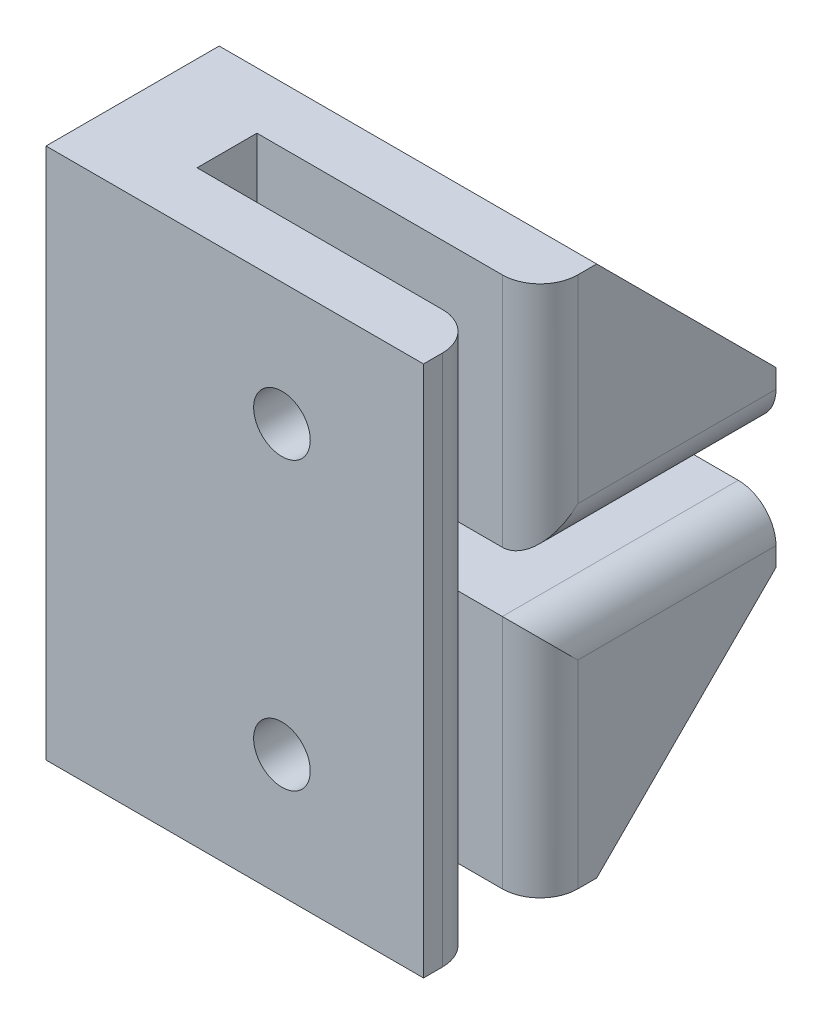
ISO-10303-21;
HEADER;
FILE_DESCRIPTION(('STEP AP214'),'2;1');
FILE_NAME('part.step','',(''),(''),'','','');
FILE_SCHEMA(('AUTOMOTIVE_DESIGN { 1 0 10303 214 1 1 1 1 }'));
ENDSEC;
DATA;
#1=APPLICATION_CONTEXT('core data for automotive mechanical design processes');
#2=APPLICATION_PROTOCOL_DEFINITION('international standard','automotive_design',2000,#1);
#3=PRODUCT_CONTEXT('',#1,'mechanical');
#4=PRODUCT('Part','Part','',(#3));
#5=PRODUCT_RELATED_PRODUCT_CATEGORY('part','',(#4));
#6=PRODUCT_DEFINITION_FORMATION('','',#4);
#7=PRODUCT_DEFINITION_CONTEXT('part definition',#1,'design');
#8=PRODUCT_DEFINITION('design','',#6,#7);
#9=PRODUCT_DEFINITION_SHAPE('','',#8);
#10=(LENGTH_UNIT() NAMED_UNIT(*) SI_UNIT(.MILLI.,.METRE.));
#11=(NAMED_UNIT(*) PLANE_ANGLE_UNIT() SI_UNIT($,.RADIAN.));
#12=(NAMED_UNIT(*) SI_UNIT($,.STERADIAN.) SOLID_ANGLE_UNIT());
#13=UNCERTAINTY_MEASURE_WITH_UNIT(LENGTH_MEASURE(1.E-05),#10,'distance_accuracy_value','');
#14=(GEOMETRIC_REPRESENTATION_CONTEXT(3) GLOBAL_UNCERTAINTY_ASSIGNED_CONTEXT((#13)) GLOBAL_UNIT_ASSIGNED_CONTEXT((#10,
#11,#12)) REPRESENTATION_CONTEXT('',''));
#15=CARTESIAN_POINT('',(0.,0.,0.));
#16=DIRECTION('',(0.,0.,1.));
#17=DIRECTION('',(1.,0.,0.));
#18=AXIS2_PLACEMENT_3D('',#15,#16,#17);
#19=CARTESIAN_POINT('',(20.2180793651192,-0.0317499401236413,0.0438719111567397));
#20=DIRECTION('',(1.,0.,0.));
#21=DIRECTION('',(0.,0.,-1.));
#22=AXIS2_PLACEMENT_3D('',#19,#20,#21);
#23=PLANE('',#22);
#24=DIRECTION('',(0.,0.,-1.));
#25=VECTOR('',#24,1.);
#26=CARTESIAN_POINT('',(20.2180793651192,-12.7817499401236,0.0438719111567382));
#27=LINE('',#26,#25);
#28=CARTESIAN_POINT('',(20.2180793651192,-12.7817499401236,6.34237191115674));
#29=VERTEX_POINT('',#28);
#30=CARTESIAN_POINT('',(20.2180793651192,-12.7817499401236,5.32237191115674));
#31=VERTEX_POINT('',#30);
#32=EDGE_CURVE('E243',#29,#31,#27,.T.);
#33=ORIENTED_EDGE('',*,*,#32,.T.);
#34=DIRECTION('',(0.,-1.,0.));
#35=VECTOR('',#34,1.);
#36=CARTESIAN_POINT('',(20.2180793651192,15.9567500598764,5.32237191115674));
#37=LINE('',#36,#35);
#38=CARTESIAN_POINT('',(20.2180793651192,15.9567500598764,5.32237191115674));
#39=VERTEX_POINT('',#38);
#40=EDGE_CURVE('E336',#31,#39,#37,.F.);
#41=ORIENTED_EDGE('',*,*,#40,.T.);
#42=DIRECTION('',(0.,0.,1.));
#43=VECTOR('',#42,1.);
#44=CARTESIAN_POINT('',(20.2180793651192,15.9567500598764,0.0438719111567396));
#45=LINE('',#44,#43);
#46=CARTESIAN_POINT('',(20.2180793651192,15.9567500598764,6.34237191115674));
#47=VERTEX_POINT('',#46);
#48=EDGE_CURVE('E259',#39,#47,#45,.T.);
#49=ORIENTED_EDGE('',*,*,#48,.T.);
#50=DIRECTION('',(0.,-1.,0.));
#51=VECTOR('',#50,1.);
#52=CARTESIAN_POINT('',(20.2180793651192,15.9567500598764,6.34237191115674));
#53=LINE('',#52,#51);
#54=EDGE_CURVE('E264',#47,#29,#53,.T.);
#55=ORIENTED_EDGE('',*,*,#54,.T.);
#56=EDGE_LOOP('',(#33,#41,#49,#55));
#57=FACE_BOUND('',#56,.T.);
#58=ADVANCED_FACE('F38',(#57),#23,.T.);
#59=CARTESIAN_POINT('',(20.2180793651192,15.9567500598764,-3.01612808884326));
#60=VERTEX_POINT('',#59);
#61=CARTESIAN_POINT('',(20.2180793651192,15.9567500598764,-1.99612808884326));
#62=VERTEX_POINT('',#61);
#63=EDGE_CURVE('E260',#60,#62,#45,.T.);
#64=ORIENTED_EDGE('',*,*,#63,.T.);
#65=DIRECTION('',(0.,1.,0.));
#66=VECTOR('',#65,1.);
#67=CARTESIAN_POINT('',(20.2180793651192,3.20675005987636,-1.99612808884326));
#68=LINE('',#67,#66);
#69=CARTESIAN_POINT('',(20.2180793651192,5.24675005987636,-1.99612808884326));
#70=VERTEX_POINT('',#69);
#71=EDGE_CURVE('E325',#62,#70,#68,.F.);
#72=ORIENTED_EDGE('',*,*,#71,.T.);
#73=DIRECTION('',(0.,0.,1.));
#74=VECTOR('',#73,1.);
#75=CARTESIAN_POINT('',(20.2180793651192,5.24675005987636,-12.7061280888433));
#76=LINE('',#75,#74);
#77=CARTESIAN_POINT('',(20.2180793651192,5.24675005987636,-12.7061280888433));
#78=VERTEX_POINT('',#77);
#79=EDGE_CURVE('E322',#70,#78,#76,.F.);
#80=ORIENTED_EDGE('',*,*,#79,.T.);
#81=DIRECTION('',(0.,1.,0.));
#82=VECTOR('',#81,1.);
#83=CARTESIAN_POINT('',(20.2180793651192,-3.09174994012364,-12.7061280888433));
#84=LINE('',#83,#82);
#85=CARTESIAN_POINT('',(20.2180793651192,6.26675005987636,-12.7061280888433));
#86=VERTEX_POINT('',#85);
#87=EDGE_CURVE('E251',#78,#86,#84,.T.);
#88=ORIENTED_EDGE('',*,*,#87,.T.);
#89=DIRECTION('',(0.,0.707106781186547,0.707106781186547));
#90=VECTOR('',#89,1.);
#91=CARTESIAN_POINT('',(20.2180793651192,15.9567500598764,-3.01612808884326));
#92=LINE('',#91,#90);
#93=EDGE_CURVE('E256',#86,#60,#92,.T.);
#94=ORIENTED_EDGE('',*,*,#93,.T.);
#95=EDGE_LOOP('',(#64,#72,#80,#88,#94));
#96=FACE_BOUND('',#95,.T.);
#97=ADVANCED_FACE('F413',(#96),#23,.T.);
#98=CARTESIAN_POINT('',(20.2180793651192,-12.7817499401236,-3.01612808884326));
#99=DIRECTION('',(0.,0.707106781186547,0.707106781186548));
#100=DIRECTION('',(0.,-0.707106781186548,0.707106781186547));
#101=AXIS2_PLACEMENT_3D('',#98,#99,#100);
#102=PLANE('',#101);
#103=CARTESIAN_POINT('',(12.5680793651192,-6.15174994012364,-9.64612808884326));
#104=DIRECTION('',(0.,0.707106781186547,0.707106781186548));
#105=DIRECTION('',(0.,-0.707106781186548,0.707106781186547));
#106=AXIS2_PLACEMENT_3D('',#103,#104,#105);
#107=ELLIPSE('',#106,2.16374675043084,1.53);
#108=CARTESIAN_POINT('',(12.5680793651192,-7.68174994012364,-8.11612808884326));
#109=VERTEX_POINT('',#108);
#110=EDGE_CURVE('E371',#109,#109,#107,.T.);
#111=ORIENTED_EDGE('',*,*,#110,.T.);
#112=EDGE_LOOP('',(#111));
#113=FACE_BOUND('',#112,.T.);
#114=DIRECTION('',(0.,0.707106781186548,-0.707106781186547));
#115=VECTOR('',#114,1.);
#116=CARTESIAN_POINT('',(-0.181920634880758,-12.7817499401236,-3.01612808884326));
#117=LINE('',#116,#115);
#118=CARTESIAN_POINT('',(-0.181920634880758,-12.7817499401236,-3.01612808884326));
#119=VERTEX_POINT('',#118);
#120=CARTESIAN_POINT('',(-0.181920634880758,-3.09174994012364,-12.7061280888433));
#121=VERTEX_POINT('',#120);
#122=EDGE_CURVE('E223',#119,#121,#117,.T.);
#123=ORIENTED_EDGE('',*,*,#122,.T.);
#124=DIRECTION('',(-1.,0.,0.));
#125=VECTOR('',#124,1.);
#126=CARTESIAN_POINT('',(20.2180793651192,-3.09174994012364,-12.7061280888433));
#127=LINE('',#126,#125);
#128=CARTESIAN_POINT('',(20.2180793651192,-3.09174994012364,-12.7061280888433));
#129=VERTEX_POINT('',#128);
#130=EDGE_CURVE('E304',#129,#121,#127,.T.);
#131=ORIENTED_EDGE('',*,*,#130,.F.);
#132=DIRECTION('',(0.,0.707106781186548,-0.707106781186547));
#133=VECTOR('',#132,1.);
#134=CARTESIAN_POINT('',(20.2180793651192,-12.7817499401236,-3.01612808884326));
#135=LINE('',#134,#133);
#136=CARTESIAN_POINT('',(20.2180793651192,-12.7817499401236,-3.01612808884326));
#137=VERTEX_POINT('',#136);
#138=EDGE_CURVE('E247',#137,#129,#135,.T.);
#139=ORIENTED_EDGE('',*,*,#138,.F.);
#140=DIRECTION('',(-1.,0.,0.));
#141=VECTOR('',#140,1.);
#142=CARTESIAN_POINT('',(20.2180793651192,-12.7817499401236,-3.01612808884326));
#143=LINE('',#142,#141);
#144=EDGE_CURVE('E308',#137,#119,#143,.T.);
#145=ORIENTED_EDGE('',*,*,#144,.T.);
#146=EDGE_LOOP('',(#123,#131,#139,#145));
#147=FACE_BOUND('',#146,.T.);
#148=ADVANCED_FACE('F420',(#113,#147),#102,.F.);
#149=CARTESIAN_POINT('',(20.2180793651192,3.20675005987636,-12.7061280888433));
#150=DIRECTION('',(0.,0.,1.));
#151=DIRECTION('',(1.,0.,0.));
#152=AXIS2_PLACEMENT_3D('',#149,#150,#151);
#153=PLANE('',#152);
#154=DIRECTION('',(1.,0.,0.));
#155=VECTOR('',#154,1.);
#156=CARTESIAN_POINT('',(4.91807936511924,-0.0317499401236414,-12.7061280888433));
#157=LINE('',#156,#155);
#158=CARTESIAN_POINT('',(4.91807936511924,-0.0317499401236414,-12.7061280888433));
#159=VERTEX_POINT('',#158);
#160=CARTESIAN_POINT('',(18.1780793651192,-0.0317499401236414,-12.7061280888433));
#161=VERTEX_POINT('',#160);
#162=EDGE_CURVE('E235',#159,#161,#157,.T.);
#163=ORIENTED_EDGE('',*,*,#162,.T.);
#164=CARTESIAN_POINT('',(18.1780793651192,-2.07174994012364,-12.7061280888433));
#165=DIRECTION('',(0.,0.,1.));
#166=DIRECTION('',(1.,0.,0.));
#167=AXIS2_PLACEMENT_3D('',#164,#165,#166);
#168=CIRCLE('',#167,2.04);
#169=CARTESIAN_POINT('',(20.2180793651192,-2.07174994012364,-12.7061280888433));
#170=VERTEX_POINT('',#169);
#171=EDGE_CURVE('E48',#161,#170,#168,.F.);
#172=ORIENTED_EDGE('',*,*,#171,.T.);
#173=EDGE_CURVE('E252',#129,#170,#84,.T.);
#174=ORIENTED_EDGE('',*,*,#173,.F.);
#175=ORIENTED_EDGE('',*,*,#130,.T.);
#176=DIRECTION('',(0.,1.,0.));
#177=VECTOR('',#176,1.);
#178=CARTESIAN_POINT('',(-0.181920634880758,3.20675005987636,-12.7061280888433));
#179=LINE('',#178,#177);
#180=CARTESIAN_POINT('',(-0.181920634880758,6.26675005987636,-12.7061280888433));
#181=VERTEX_POINT('',#180);
#182=EDGE_CURVE('E272',#121,#181,#179,.T.);
#183=ORIENTED_EDGE('',*,*,#182,.T.);
#184=DIRECTION('',(-1.,0.,0.));
#185=VECTOR('',#184,1.);
#186=CARTESIAN_POINT('',(20.2180793651192,6.26675005987636,-12.7061280888433));
#187=LINE('',#186,#185);
#188=EDGE_CURVE('E300',#86,#181,#187,.T.);
#189=ORIENTED_EDGE('',*,*,#188,.F.);
#190=ORIENTED_EDGE('',*,*,#87,.F.);
#191=CARTESIAN_POINT('',(18.1780793651192,5.24675005987636,-12.7061280888433));
#192=DIRECTION('',(0.,0.,1.));
#193=DIRECTION('',(1.,0.,0.));
#194=AXIS2_PLACEMENT_3D('',#191,#192,#193);
#195=CIRCLE('',#194,2.04);
#196=CARTESIAN_POINT('',(18.1780793651192,3.20675005987636,-12.7061280888433));
#197=VERTEX_POINT('',#196);
#198=EDGE_CURVE('E56',#78,#197,#195,.F.);
#199=ORIENTED_EDGE('',*,*,#198,.T.);
#200=DIRECTION('',(1.,0.,0.));
#201=VECTOR('',#200,1.);
#202=CARTESIAN_POINT('',(4.91807936511924,3.20675005987636,-12.7061280888433));
#203=LINE('',#202,#201);
#204=CARTESIAN_POINT('',(4.91807936511924,3.20675005987636,-12.7061280888433));
#205=VERTEX_POINT('',#204);
#206=EDGE_CURVE('E232',#205,#197,#203,.T.);
#207=ORIENTED_EDGE('',*,*,#206,.F.);
#208=DIRECTION('',(0.,1.,0.));
#209=VECTOR('',#208,1.);
#210=CARTESIAN_POINT('',(4.91807936511924,-0.0317499401236414,-12.7061280888433));
#211=LINE('',#210,#209);
#212=EDGE_CURVE('E207',#159,#205,#211,.T.);
#213=ORIENTED_EDGE('',*,*,#212,.F.);
#214=EDGE_LOOP('',(#163,#172,#174,#175,#183,#189,#190,#199,#207,#213));
#215=FACE_BOUND('',#214,.T.);
#216=ADVANCED_FACE('F449',(#215),#153,.F.);
#217=CARTESIAN_POINT('',(20.2180793651192,15.9567500598764,-3.01612808884326));
#218=DIRECTION('',(0.,-0.707106781186548,0.707106781186548));
#219=DIRECTION('',(0.,-0.707106781186548,-0.707106781186548));
#220=AXIS2_PLACEMENT_3D('',#217,#218,#219);
#221=PLANE('',#220);
#222=CARTESIAN_POINT('',(12.5680793651192,9.32675005987636,-9.64612808884326));
#223=DIRECTION('',(0.,-0.707106781186548,0.707106781186548));
#224=DIRECTION('',(0.,0.707106781186548,0.707106781186548));
#225=AXIS2_PLACEMENT_3D('',#222,#223,#224);
#226=ELLIPSE('',#225,2.16374675043083,1.53);
#227=CARTESIAN_POINT('',(12.5680793651192,10.8567500598764,-8.11612808884326));
#228=VERTEX_POINT('',#227);
#229=EDGE_CURVE('E360',#228,#228,#226,.T.);
#230=ORIENTED_EDGE('',*,*,#229,.T.);
#231=EDGE_LOOP('',(#230));
#232=FACE_BOUND('',#231,.T.);
#233=DIRECTION('',(0.,0.707106781186547,0.707106781186547));
#234=VECTOR('',#233,1.);
#235=CARTESIAN_POINT('',(-0.181920634880758,15.9567500598764,-3.01612808884326));
#236=LINE('',#235,#234);
#237=CARTESIAN_POINT('',(-0.181920634880758,15.9567500598764,-3.01612808884326));
#238=VERTEX_POINT('',#237);
#239=EDGE_CURVE('E275',#181,#238,#236,.T.);
#240=ORIENTED_EDGE('',*,*,#239,.T.);
#241=DIRECTION('',(-1.,0.,0.));
#242=VECTOR('',#241,1.);
#243=CARTESIAN_POINT('',(20.2180793651192,15.9567500598764,-3.01612808884326));
#244=LINE('',#243,#242);
#245=EDGE_CURVE('E296',#60,#238,#244,.T.);
#246=ORIENTED_EDGE('',*,*,#245,.F.);
#247=ORIENTED_EDGE('',*,*,#93,.F.);
#248=ORIENTED_EDGE('',*,*,#188,.T.);
#249=EDGE_LOOP('',(#240,#246,#247,#248));
#250=FACE_BOUND('',#249,.T.);
#251=ADVANCED_FACE('F392',(#232,#250),#221,.F.);
#252=CARTESIAN_POINT('',(20.2180793651192,15.9567500598764,6.34237191115674));
#253=DIRECTION('',(0.,-1.,0.));
#254=DIRECTION('',(0.,0.,-1.));
#255=AXIS2_PLACEMENT_3D('',#252,#253,#254);
#256=PLANE('',#255);
#257=DIRECTION('',(1.,0.,0.));
#258=VECTOR('',#257,1.);
#259=CARTESIAN_POINT('',(4.91807936511924,15.9567500598764,0.0438719111567397));
#260=LINE('',#259,#258);
#261=CARTESIAN_POINT('',(4.91807936511924,15.9567500598764,0.0438719111567397));
#262=VERTEX_POINT('',#261);
#263=CARTESIAN_POINT('',(18.1780793651192,15.9567500598764,0.0438719111567397));
#264=VERTEX_POINT('',#263);
#265=EDGE_CURVE('E224',#262,#264,#260,.T.);
#266=ORIENTED_EDGE('',*,*,#265,.T.);
#267=CARTESIAN_POINT('',(18.1780793651192,15.9567500598764,-1.99612808884326));
#268=DIRECTION('',(0.,-1.,0.));
#269=DIRECTION('',(0.,0.,-1.));
#270=AXIS2_PLACEMENT_3D('',#267,#268,#269);
#271=CIRCLE('',#270,2.04);
#272=EDGE_CURVE('E319',#264,#62,#271,.F.);
#273=ORIENTED_EDGE('',*,*,#272,.T.);
#274=ORIENTED_EDGE('',*,*,#63,.F.);
#275=ORIENTED_EDGE('',*,*,#245,.T.);
#276=DIRECTION('',(0.,0.,1.));
#277=VECTOR('',#276,1.);
#278=CARTESIAN_POINT('',(-0.181920634880758,15.9567500598764,6.34237191115674));
#279=LINE('',#278,#277);
#280=CARTESIAN_POINT('',(-0.181920634880758,15.9567500598764,6.34237191115674));
#281=VERTEX_POINT('',#280);
#282=EDGE_CURVE('E279',#238,#281,#279,.T.);
#283=ORIENTED_EDGE('',*,*,#282,.T.);
#284=DIRECTION('',(-1.,0.,0.));
#285=VECTOR('',#284,1.);
#286=CARTESIAN_POINT('',(20.2180793651192,15.9567500598764,6.34237191115674));
#287=LINE('',#286,#285);
#288=EDGE_CURVE('E292',#47,#281,#287,.T.);
#289=ORIENTED_EDGE('',*,*,#288,.F.);
#290=ORIENTED_EDGE('',*,*,#48,.F.);
#291=CARTESIAN_POINT('',(18.1780793651192,15.9567500598764,5.32237191115674));
#292=DIRECTION('',(0.,-1.,0.));
#293=DIRECTION('',(0.,0.,-1.));
#294=AXIS2_PLACEMENT_3D('',#291,#292,#293);
#295=CIRCLE('',#294,2.04);
#296=CARTESIAN_POINT('',(18.1780793651192,15.9567500598764,3.28237191115674));
#297=VERTEX_POINT('',#296);
#298=EDGE_CURVE('E316',#39,#297,#295,.F.);
#299=ORIENTED_EDGE('',*,*,#298,.T.);
#300=DIRECTION('',(1.,0.,0.));
#301=VECTOR('',#300,1.);
#302=CARTESIAN_POINT('',(4.91807936511924,15.9567500598764,3.28237191115674));
#303=LINE('',#302,#301);
#304=CARTESIAN_POINT('',(4.91807936511924,15.9567500598764,3.28237191115674));
#305=VERTEX_POINT('',#304);
#306=EDGE_CURVE('E220',#305,#297,#303,.T.);
#307=ORIENTED_EDGE('',*,*,#306,.F.);
#308=DIRECTION('',(0.,0.,1.));
#309=VECTOR('',#308,1.);
#310=CARTESIAN_POINT('',(4.91807936511924,15.9567500598764,3.28237191115674));
#311=LINE('',#310,#309);
#312=EDGE_CURVE('E180',#262,#305,#311,.T.);
#313=ORIENTED_EDGE('',*,*,#312,.F.);
#314=EDGE_LOOP('',(#266,#273,#274,#275,#283,#289,#290,#299,#307,#313));
#315=FACE_BOUND('',#314,.T.);
#316=ADVANCED_FACE('F465',(#315),#256,.F.);
#317=CARTESIAN_POINT('',(20.2180793651192,15.9567500598764,6.34237191115674));
#318=DIRECTION('',(0.,0.,-1.));
#319=DIRECTION('',(0.,1.,0.));
#320=AXIS2_PLACEMENT_3D('',#317,#318,#319);
#321=PLANE('',#320);
#322=CARTESIAN_POINT('',(12.5680793651192,9.32675005987636,6.34237191115674));
#323=DIRECTION('',(0.,0.,1.));
#324=DIRECTION('',(1.,0.,0.));
#325=AXIS2_PLACEMENT_3D('',#322,#323,#324);
#326=CIRCLE('',#325,1.53);
#327=CARTESIAN_POINT('',(14.0980793651192,9.32675005987636,6.34237191115674));
#328=VERTEX_POINT('',#327);
#329=EDGE_CURVE('E365',#328,#328,#326,.T.);
#330=ORIENTED_EDGE('',*,*,#329,.F.);
#331=EDGE_LOOP('',(#330));
#332=FACE_BOUND('',#331,.T.);
#333=CARTESIAN_POINT('',(12.5680793651192,-6.15174994012364,6.34237191115674));
#334=DIRECTION('',(0.,0.,1.));
#335=DIRECTION('',(1.,0.,0.));
#336=AXIS2_PLACEMENT_3D('',#333,#334,#335);
#337=CIRCLE('',#336,1.53);
#338=CARTESIAN_POINT('',(14.0980793651193,-6.15174994012364,6.34237191115674));
#339=VERTEX_POINT('',#338);
#340=EDGE_CURVE('E374',#339,#339,#337,.T.);
#341=ORIENTED_EDGE('',*,*,#340,.F.);
#342=EDGE_LOOP('',(#341));
#343=FACE_BOUND('',#342,.T.);
#344=DIRECTION('',(0.,-1.,0.));
#345=VECTOR('',#344,1.);
#346=CARTESIAN_POINT('',(-0.181920634880758,15.9567500598764,6.34237191115674));
#347=LINE('',#346,#345);
#348=CARTESIAN_POINT('',(-0.181920634880758,-12.7817499401236,6.34237191115674));
#349=VERTEX_POINT('',#348);
#350=EDGE_CURVE('E282',#281,#349,#347,.T.);
#351=ORIENTED_EDGE('',*,*,#350,.T.);
#352=DIRECTION('',(-1.,0.,0.));
#353=VECTOR('',#352,1.);
#354=CARTESIAN_POINT('',(20.2180793651192,-12.7817499401236,6.34237191115674));
#355=LINE('',#354,#353);
#356=EDGE_CURVE('E268',#29,#349,#355,.T.);
#357=ORIENTED_EDGE('',*,*,#356,.F.);
#358=ORIENTED_EDGE('',*,*,#54,.F.);
#359=ORIENTED_EDGE('',*,*,#288,.T.);
#360=EDGE_LOOP('',(#351,#357,#358,#359));
#361=FACE_BOUND('',#360,.T.);
#362=ADVANCED_FACE('F432',(#332,#343,#361),#321,.F.);
#363=CARTESIAN_POINT('',(20.2180793651192,-12.7817499401236,0.0438719111567382));
#364=DIRECTION('',(0.,1.,0.));
#365=DIRECTION('',(0.,0.,1.));
#366=AXIS2_PLACEMENT_3D('',#363,#364,#365);
#367=PLANE('',#366);
#368=DIRECTION('',(1.,0.,0.));
#369=VECTOR('',#368,1.);
#370=CARTESIAN_POINT('',(4.91807936511924,-12.7817499401236,3.28237191115674));
#371=LINE('',#370,#369);
#372=CARTESIAN_POINT('',(4.91807936511924,-12.7817499401236,3.28237191115674));
#373=VERTEX_POINT('',#372);
#374=CARTESIAN_POINT('',(18.1780793651192,-12.7817499401236,3.28237191115674));
#375=VERTEX_POINT('',#374);
#376=EDGE_CURVE('E168',#373,#375,#371,.T.);
#377=ORIENTED_EDGE('',*,*,#376,.T.);
#378=CARTESIAN_POINT('',(18.1780793651192,-12.7817499401236,5.32237191115674));
#379=DIRECTION('',(0.,1.,0.));
#380=DIRECTION('',(0.,0.,1.));
#381=AXIS2_PLACEMENT_3D('',#378,#379,#380);
#382=CIRCLE('',#381,2.04);
#383=EDGE_CURVE('E333',#375,#31,#382,.F.);
#384=ORIENTED_EDGE('',*,*,#383,.T.);
#385=ORIENTED_EDGE('',*,*,#32,.F.);
#386=ORIENTED_EDGE('',*,*,#356,.T.);
#387=DIRECTION('',(0.,0.,-1.));
#388=VECTOR('',#387,1.);
#389=CARTESIAN_POINT('',(-0.181920634880758,-12.7817499401236,0.0438719111567382));
#390=LINE('',#389,#388);
#391=EDGE_CURVE('E286',#349,#119,#390,.T.);
#392=ORIENTED_EDGE('',*,*,#391,.T.);
#393=ORIENTED_EDGE('',*,*,#144,.F.);
#394=CARTESIAN_POINT('',(20.2180793651192,-12.7817499401236,-1.99612808884326));
#395=VERTEX_POINT('',#394);
#396=EDGE_CURVE('E248',#395,#137,#27,.T.);
#397=ORIENTED_EDGE('',*,*,#396,.F.);
#398=CARTESIAN_POINT('',(18.1780793651192,-12.7817499401236,-1.99612808884326));
#399=DIRECTION('',(0.,1.,0.));
#400=DIRECTION('',(0.,0.,1.));
#401=AXIS2_PLACEMENT_3D('',#398,#399,#400);
#402=CIRCLE('',#401,2.04);
#403=CARTESIAN_POINT('',(18.1780793651192,-12.7817499401236,0.0438719111567382));
#404=VERTEX_POINT('',#403);
#405=EDGE_CURVE('E330',#395,#404,#402,.F.);
#406=ORIENTED_EDGE('',*,*,#405,.T.);
#407=DIRECTION('',(1.,0.,0.));
#408=VECTOR('',#407,1.);
#409=CARTESIAN_POINT('',(4.91807936511924,-12.7817499401236,0.0438719111567382));
#410=LINE('',#409,#408);
#411=CARTESIAN_POINT('',(4.91807936511924,-12.7817499401236,0.0438719111567382));
#412=VERTEX_POINT('',#411);
#413=EDGE_CURVE('E179',#412,#404,#410,.T.);
#414=ORIENTED_EDGE('',*,*,#413,.F.);
#415=DIRECTION('',(0.,0.,-1.));
#416=VECTOR('',#415,1.);
#417=CARTESIAN_POINT('',(4.91807936511924,-12.7817499401236,3.28237191115674));
#418=LINE('',#417,#416);
#419=EDGE_CURVE('E186',#373,#412,#418,.T.);
#420=ORIENTED_EDGE('',*,*,#419,.F.);
#421=EDGE_LOOP('',(#377,#384,#385,#386,#392,#393,#397,#406,#414,#420));
#422=FACE_BOUND('',#421,.T.);
#423=ADVANCED_FACE('F194',(#422),#367,.F.);
#424=DIRECTION('',(0.,0.,-1.));
#425=VECTOR('',#424,1.);
#426=CARTESIAN_POINT('',(20.2180793651192,-2.07174994012364,0.0438719111567397));
#427=LINE('',#426,#425);
#428=CARTESIAN_POINT('',(20.2180793651192,-2.07174994012364,-1.99612808884326));
#429=VERTEX_POINT('',#428);
#430=EDGE_CURVE('E343',#170,#429,#427,.F.);
#431=ORIENTED_EDGE('',*,*,#430,.T.);
#432=DIRECTION('',(0.,1.,0.));
#433=VECTOR('',#432,1.);
#434=CARTESIAN_POINT('',(20.2180793651192,-12.7817499401236,-1.99612808884326));
#435=LINE('',#434,#433);
#436=EDGE_CURVE('E346',#429,#395,#435,.F.);
#437=ORIENTED_EDGE('',*,*,#436,.T.);
#438=ORIENTED_EDGE('',*,*,#396,.T.);
#439=ORIENTED_EDGE('',*,*,#138,.T.);
#440=ORIENTED_EDGE('',*,*,#173,.T.);
#441=EDGE_LOOP('',(#431,#437,#438,#439,#440));
#442=FACE_BOUND('',#441,.T.);
#443=ADVANCED_FACE('F416',(#442),#23,.T.);
#444=CARTESIAN_POINT('',(-0.181920634880758,-0.0317499401236413,0.0438719111567397));
#445=DIRECTION('',(1.,0.,0.));
#446=DIRECTION('',(0.,0.,-1.));
#447=AXIS2_PLACEMENT_3D('',#444,#445,#446);
#448=PLANE('',#447);
#449=ORIENTED_EDGE('',*,*,#122,.F.);
#450=ORIENTED_EDGE('',*,*,#391,.F.);
#451=ORIENTED_EDGE('',*,*,#350,.F.);
#452=ORIENTED_EDGE('',*,*,#282,.F.);
#453=ORIENTED_EDGE('',*,*,#239,.F.);
#454=ORIENTED_EDGE('',*,*,#182,.F.);
#455=EDGE_LOOP('',(#449,#450,#451,#452,#453,#454));
#456=FACE_BOUND('',#455,.T.);
#457=ADVANCED_FACE('F425',(#456),#448,.F.);
#458=CARTESIAN_POINT('',(4.91807936511924,3.20675005987636,3.28237191115674));
#459=DIRECTION('',(0.,0.,1.));
#460=DIRECTION('',(1.,0.,0.));
#461=AXIS2_PLACEMENT_3D('',#458,#459,#460);
#462=PLANE('',#461);
#463=CARTESIAN_POINT('',(12.5680793651192,9.32675005987636,3.28237191115674));
#464=DIRECTION('',(0.,0.,1.));
#465=DIRECTION('',(1.,0.,0.));
#466=AXIS2_PLACEMENT_3D('',#463,#464,#465);
#467=CIRCLE('',#466,1.53);
#468=CARTESIAN_POINT('',(14.0980793651192,9.32675005987636,3.28237191115674));
#469=VERTEX_POINT('',#468);
#470=EDGE_CURVE('E385',#469,#469,#467,.T.);
#471=ORIENTED_EDGE('',*,*,#470,.T.);
#472=EDGE_LOOP('',(#471));
#473=FACE_BOUND('',#472,.T.);
#474=CARTESIAN_POINT('',(12.5680793651192,-6.15174994012364,3.28237191115674));
#475=DIRECTION('',(0.,0.,1.));
#476=DIRECTION('',(1.,0.,0.));
#477=AXIS2_PLACEMENT_3D('',#474,#475,#476);
#478=CIRCLE('',#477,1.53);
#479=CARTESIAN_POINT('',(14.0980793651193,-6.15174994012364,3.28237191115674));
#480=VERTEX_POINT('',#479);
#481=EDGE_CURVE('E364',#480,#480,#478,.T.);
#482=ORIENTED_EDGE('',*,*,#481,.T.);
#483=EDGE_LOOP('',(#482));
#484=FACE_BOUND('',#483,.T.);
#485=ORIENTED_EDGE('',*,*,#306,.T.);
#486=DIRECTION('',(0.,-1.,0.));
#487=VECTOR('',#486,1.);
#488=CARTESIAN_POINT('',(18.1780793651192,-12.7817499401236,3.28237191115674));
#489=LINE('',#488,#487);
#490=EDGE_CURVE('E175',#297,#375,#489,.T.);
#491=ORIENTED_EDGE('',*,*,#490,.T.);
#492=ORIENTED_EDGE('',*,*,#376,.F.);
#493=DIRECTION('',(0.,-1.,0.));
#494=VECTOR('',#493,1.);
#495=CARTESIAN_POINT('',(4.91807936511924,3.20675005987636,3.28237191115674));
#496=LINE('',#495,#494);
#497=EDGE_CURVE('E172',#305,#373,#496,.T.);
#498=ORIENTED_EDGE('',*,*,#497,.F.);
#499=EDGE_LOOP('',(#485,#491,#492,#498));
#500=FACE_BOUND('',#499,.T.);
#501=ADVANCED_FACE('F171',(#473,#484,#500),#462,.F.);
#502=CARTESIAN_POINT('',(4.91807936511924,15.9567500598764,0.0438719111567397));
#503=DIRECTION('',(0.,0.,-1.));
#504=DIRECTION('',(-1.,0.,0.));
#505=AXIS2_PLACEMENT_3D('',#502,#503,#504);
#506=PLANE('',#505);
#507=CARTESIAN_POINT('',(12.5680793651192,9.32675005987636,0.0438719111567397));
#508=DIRECTION('',(0.,0.,-1.));
#509=DIRECTION('',(-1.,0.,0.));
#510=AXIS2_PLACEMENT_3D('',#507,#508,#509);
#511=CIRCLE('',#510,1.53);
#512=CARTESIAN_POINT('',(11.0380793651192,9.32675005987636,0.0438719111567397));
#513=VERTEX_POINT('',#512);
#514=EDGE_CURVE('E42',#513,#513,#511,.T.);
#515=ORIENTED_EDGE('',*,*,#514,.T.);
#516=EDGE_LOOP('',(#515));
#517=FACE_BOUND('',#516,.T.);
#518=DIRECTION('',(1.,0.,0.));
#519=VECTOR('',#518,1.);
#520=CARTESIAN_POINT('',(4.91807936511924,3.20675005987636,0.0438719111567397));
#521=LINE('',#520,#519);
#522=CARTESIAN_POINT('',(4.91807936511924,3.20675005987636,0.0438719111567397));
#523=VERTEX_POINT('',#522);
#524=CARTESIAN_POINT('',(18.1780793651192,3.20675005987636,0.0438719111567397));
#525=VERTEX_POINT('',#524);
#526=EDGE_CURVE('E228',#523,#525,#521,.T.);
#527=ORIENTED_EDGE('',*,*,#526,.T.);
#528=DIRECTION('',(0.,1.,0.));
#529=VECTOR('',#528,1.);
#530=CARTESIAN_POINT('',(18.1780793651192,15.9567500598764,0.0438719111567397));
#531=LINE('',#530,#529);
#532=EDGE_CURVE('E312',#525,#264,#531,.T.);
#533=ORIENTED_EDGE('',*,*,#532,.T.);
#534=ORIENTED_EDGE('',*,*,#265,.F.);
#535=DIRECTION('',(0.,1.,0.));
#536=VECTOR('',#535,1.);
#537=CARTESIAN_POINT('',(4.91807936511924,15.9567500598764,0.0438719111567397));
#538=LINE('',#537,#536);
#539=EDGE_CURVE('E215',#523,#262,#538,.T.);
#540=ORIENTED_EDGE('',*,*,#539,.F.);
#541=EDGE_LOOP('',(#527,#533,#534,#540));
#542=FACE_BOUND('',#541,.T.);
#543=ADVANCED_FACE('F462',(#517,#542),#506,.F.);
#544=CARTESIAN_POINT('',(4.91807936511924,3.20675005987636,-12.7061280888433));
#545=DIRECTION('',(0.,1.,0.));
#546=DIRECTION('',(0.,0.,1.));
#547=AXIS2_PLACEMENT_3D('',#544,#545,#546);
#548=PLANE('',#547);
#549=ORIENTED_EDGE('',*,*,#206,.T.);
#550=DIRECTION('',(0.,0.,1.));
#551=VECTOR('',#550,1.);
#552=CARTESIAN_POINT('',(18.1780793651192,3.20675005987636,0.0438719111567397));
#553=LINE('',#552,#551);
#554=EDGE_CURVE('E11',#197,#525,#553,.T.);
#555=ORIENTED_EDGE('',*,*,#554,.T.);
#556=ORIENTED_EDGE('',*,*,#526,.F.);
#557=DIRECTION('',(0.,0.,1.));
#558=VECTOR('',#557,1.);
#559=CARTESIAN_POINT('',(4.91807936511924,3.20675005987636,-12.7061280888433));
#560=LINE('',#559,#558);
#561=EDGE_CURVE('E211',#205,#523,#560,.T.);
#562=ORIENTED_EDGE('',*,*,#561,.F.);
#563=EDGE_LOOP('',(#549,#555,#556,#562));
#564=FACE_BOUND('',#563,.T.);
#565=ADVANCED_FACE('F452',(#564),#548,.F.);
#566=CARTESIAN_POINT('',(4.91807936511924,-0.0317499401236413,0.0438719111567397));
#567=DIRECTION('',(0.,-1.,0.));
#568=DIRECTION('',(0.,0.,-1.));
#569=AXIS2_PLACEMENT_3D('',#566,#567,#568);
#570=PLANE('',#569);
#571=DIRECTION('',(1.,0.,0.));
#572=VECTOR('',#571,1.);
#573=CARTESIAN_POINT('',(4.91807936511924,-0.0317499401236413,0.0438719111567397));
#574=LINE('',#573,#572);
#575=CARTESIAN_POINT('',(4.91807936511924,-0.0317499401236413,0.0438719111567397));
#576=VERTEX_POINT('',#575);
#577=CARTESIAN_POINT('',(18.1780793651192,-0.0317499401236413,0.0438719111567397));
#578=VERTEX_POINT('',#577);
#579=EDGE_CURVE('E238',#576,#578,#574,.T.);
#580=ORIENTED_EDGE('',*,*,#579,.T.);
#581=DIRECTION('',(0.,0.,-1.));
#582=VECTOR('',#581,1.);
#583=CARTESIAN_POINT('',(18.1780793651192,-0.0317499401236413,-12.7061280888433));
#584=LINE('',#583,#582);
#585=EDGE_CURVE('E64',#578,#161,#584,.T.);
#586=ORIENTED_EDGE('',*,*,#585,.T.);
#587=ORIENTED_EDGE('',*,*,#162,.F.);
#588=DIRECTION('',(0.,0.,-1.));
#589=VECTOR('',#588,1.);
#590=CARTESIAN_POINT('',(4.91807936511924,-0.0317499401236413,0.0438719111567397));
#591=LINE('',#590,#589);
#592=EDGE_CURVE('E200',#576,#159,#591,.T.);
#593=ORIENTED_EDGE('',*,*,#592,.F.);
#594=EDGE_LOOP('',(#580,#586,#587,#593));
#595=FACE_BOUND('',#594,.T.);
#596=ADVANCED_FACE('F447',(#595),#570,.F.);
#597=CARTESIAN_POINT('',(4.91807936511924,-12.7817499401236,0.0438719111567382));
#598=DIRECTION('',(0.,0.,-1.));
#599=DIRECTION('',(0.,1.,0.));
#600=AXIS2_PLACEMENT_3D('',#597,#598,#599);
#601=PLANE('',#600);
#602=CARTESIAN_POINT('',(12.5680793651192,-6.15174994012364,0.043871911156738));
#603=DIRECTION('',(0.,0.,-1.));
#604=DIRECTION('',(0.,1.,0.));
#605=AXIS2_PLACEMENT_3D('',#602,#603,#604);
#606=CIRCLE('',#605,1.53);
#607=CARTESIAN_POINT('',(12.5680793651192,-4.62174994012364,0.0438719111567381));
#608=VERTEX_POINT('',#607);
#609=EDGE_CURVE('E361',#608,#608,#606,.T.);
#610=ORIENTED_EDGE('',*,*,#609,.T.);
#611=EDGE_LOOP('',(#610));
#612=FACE_BOUND('',#611,.T.);
#613=ORIENTED_EDGE('',*,*,#413,.T.);
#614=DIRECTION('',(0.,1.,0.));
#615=VECTOR('',#614,1.);
#616=CARTESIAN_POINT('',(18.1780793651192,-0.0317499401236416,0.0438719111567397));
#617=LINE('',#616,#615);
#618=EDGE_CURVE('E339',#404,#578,#617,.T.);
#619=ORIENTED_EDGE('',*,*,#618,.T.);
#620=ORIENTED_EDGE('',*,*,#579,.F.);
#621=DIRECTION('',(0.,1.,0.));
#622=VECTOR('',#621,1.);
#623=CARTESIAN_POINT('',(4.91807936511924,-12.7817499401236,0.0438719111567382));
#624=LINE('',#623,#622);
#625=EDGE_CURVE('E197',#412,#576,#624,.T.);
#626=ORIENTED_EDGE('',*,*,#625,.F.);
#627=EDGE_LOOP('',(#613,#619,#620,#626));
#628=FACE_BOUND('',#627,.T.);
#629=ADVANCED_FACE('F445',(#612,#628),#601,.F.);
#630=CARTESIAN_POINT('',(4.91807936511924,-0.0317499401236413,0.0438719111567397));
#631=DIRECTION('',(1.,0.,0.));
#632=DIRECTION('',(0.,0.,-1.));
#633=AXIS2_PLACEMENT_3D('',#630,#631,#632);
#634=PLANE('',#633);
#635=ORIENTED_EDGE('',*,*,#497,.T.);
#636=ORIENTED_EDGE('',*,*,#419,.T.);
#637=ORIENTED_EDGE('',*,*,#625,.T.);
#638=ORIENTED_EDGE('',*,*,#592,.T.);
#639=ORIENTED_EDGE('',*,*,#212,.T.);
#640=ORIENTED_EDGE('',*,*,#561,.T.);
#641=ORIENTED_EDGE('',*,*,#539,.T.);
#642=ORIENTED_EDGE('',*,*,#312,.T.);
#643=EDGE_LOOP('',(#635,#636,#637,#638,#639,#640,#641,#642));
#644=FACE_BOUND('',#643,.T.);
#645=ADVANCED_FACE('F184',(#644),#634,.T.);
#646=CARTESIAN_POINT('',(18.1780793651192,5.24675005987636,-12.7061280888433));
#647=DIRECTION('',(0.,0.,-1.));
#648=DIRECTION('',(-1.,0.,0.));
#649=AXIS2_PLACEMENT_3D('',#646,#647,#648);
#650=CYLINDRICAL_SURFACE('',#649,2.04);
#651=ORIENTED_EDGE('',*,*,#198,.F.);
#652=ORIENTED_EDGE('',*,*,#79,.F.);
#653=CARTESIAN_POINT('',(18.1780793651192,5.24675005987636,-1.99612808884326));
#654=DIRECTION('',(0.,-0.707106781186547,-0.707106781186547));
#655=DIRECTION('',(0.,0.707106781186547,-0.707106781186547));
#656=AXIS2_PLACEMENT_3D('',#653,#654,#655);
#657=ELLIPSE('',#656,2.88499566724111,2.04);
#658=EDGE_CURVE('E192',#525,#70,#657,.F.);
#659=ORIENTED_EDGE('',*,*,#658,.F.);
#660=ORIENTED_EDGE('',*,*,#554,.F.);
#661=EDGE_LOOP('',(#651,#652,#659,#660));
#662=FACE_BOUND('',#661,.T.);
#663=ADVANCED_FACE('F455',(#662),#650,.T.);
#664=CARTESIAN_POINT('',(18.1780793651192,15.9567500598764,-1.99612808884326));
#665=DIRECTION('',(0.,-1.,0.));
#666=DIRECTION('',(0.,0.,-1.));
#667=AXIS2_PLACEMENT_3D('',#664,#665,#666);
#668=CYLINDRICAL_SURFACE('',#667,2.04);
#669=ORIENTED_EDGE('',*,*,#658,.T.);
#670=ORIENTED_EDGE('',*,*,#71,.F.);
#671=ORIENTED_EDGE('',*,*,#272,.F.);
#672=ORIENTED_EDGE('',*,*,#532,.F.);
#673=EDGE_LOOP('',(#669,#670,#671,#672));
#674=FACE_BOUND('',#673,.T.);
#675=ADVANCED_FACE('F460',(#674),#668,.T.);
#676=CARTESIAN_POINT('',(18.1780793651192,3.20675005987636,5.32237191115674));
#677=DIRECTION('',(0.,1.,0.));
#678=DIRECTION('',(0.,0.,1.));
#679=AXIS2_PLACEMENT_3D('',#676,#677,#678);
#680=CYLINDRICAL_SURFACE('',#679,2.04);
#681=ORIENTED_EDGE('',*,*,#298,.F.);
#682=ORIENTED_EDGE('',*,*,#40,.F.);
#683=ORIENTED_EDGE('',*,*,#383,.F.);
#684=ORIENTED_EDGE('',*,*,#490,.F.);
#685=EDGE_LOOP('',(#681,#682,#683,#684));
#686=FACE_BOUND('',#685,.T.);
#687=ADVANCED_FACE('F470',(#686),#680,.T.);
#688=CARTESIAN_POINT('',(18.1780793651192,-2.07174994012364,0.0438719111567397));
#689=DIRECTION('',(0.,0.,1.));
#690=DIRECTION('',(0.,-1.,0.));
#691=AXIS2_PLACEMENT_3D('',#688,#689,#690);
#692=CYLINDRICAL_SURFACE('',#691,2.04);
#693=ORIENTED_EDGE('',*,*,#171,.F.);
#694=ORIENTED_EDGE('',*,*,#585,.F.);
#695=CARTESIAN_POINT('',(18.1780793651192,-2.07174994012364,-1.99612808884326));
#696=DIRECTION('',(0.,-0.707106781186548,0.707106781186547));
#697=DIRECTION('',(0.,0.707106781186547,0.707106781186548));
#698=AXIS2_PLACEMENT_3D('',#695,#696,#697);
#699=ELLIPSE('',#698,2.88499566724111,2.04);
#700=EDGE_CURVE('E358',#429,#578,#699,.T.);
#701=ORIENTED_EDGE('',*,*,#700,.F.);
#702=ORIENTED_EDGE('',*,*,#430,.F.);
#703=EDGE_LOOP('',(#693,#694,#701,#702));
#704=FACE_BOUND('',#703,.T.);
#705=ADVANCED_FACE('F40',(#704),#692,.T.);
#706=CARTESIAN_POINT('',(18.1780793651192,-12.7817499401236,-1.99612808884326));
#707=DIRECTION('',(0.,-1.,0.));
#708=DIRECTION('',(0.,0.,-1.));
#709=AXIS2_PLACEMENT_3D('',#706,#707,#708);
#710=CYLINDRICAL_SURFACE('',#709,2.04);
#711=ORIENTED_EDGE('',*,*,#405,.F.);
#712=ORIENTED_EDGE('',*,*,#436,.F.);
#713=ORIENTED_EDGE('',*,*,#700,.T.);
#714=ORIENTED_EDGE('',*,*,#618,.F.);
#715=EDGE_LOOP('',(#711,#712,#713,#714));
#716=FACE_BOUND('',#715,.T.);
#717=ADVANCED_FACE('F408',(#716),#710,.T.);
#718=CARTESIAN_POINT('',(12.5680793651192,-6.15174994012364,-12.7061280888433));
#719=DIRECTION('',(0.,0.,1.));
#720=DIRECTION('',(1.,0.,0.));
#721=AXIS2_PLACEMENT_3D('',#718,#719,#720);
#722=CYLINDRICAL_SURFACE('',#721,1.53);
#723=ORIENTED_EDGE('',*,*,#609,.F.);
#724=EDGE_LOOP('',(#723));
#725=FACE_BOUND('',#724,.T.);
#726=ORIENTED_EDGE('',*,*,#110,.F.);
#727=EDGE_LOOP('',(#726));
#728=FACE_BOUND('',#727,.T.);
#729=ADVANCED_FACE('F398',(#725,#728),#722,.F.);
#730=CARTESIAN_POINT('',(12.5680793651192,9.32675005987636,-12.7061280888433));
#731=DIRECTION('',(0.,0.,1.));
#732=DIRECTION('',(1.,0.,0.));
#733=AXIS2_PLACEMENT_3D('',#730,#731,#732);
#734=CYLINDRICAL_SURFACE('',#733,1.53);
#735=ORIENTED_EDGE('',*,*,#514,.F.);
#736=EDGE_LOOP('',(#735));
#737=FACE_BOUND('',#736,.T.);
#738=ORIENTED_EDGE('',*,*,#229,.F.);
#739=EDGE_LOOP('',(#738));
#740=FACE_BOUND('',#739,.T.);
#741=ADVANCED_FACE('F395',(#737,#740),#734,.F.);
#742=ORIENTED_EDGE('',*,*,#340,.T.);
#743=EDGE_LOOP('',(#742));
#744=FACE_BOUND('',#743,.T.);
#745=ORIENTED_EDGE('',*,*,#481,.F.);
#746=EDGE_LOOP('',(#745));
#747=FACE_BOUND('',#746,.T.);
#748=ADVANCED_FACE('F397',(#744,#747),#722,.F.);
#749=ORIENTED_EDGE('',*,*,#329,.T.);
#750=EDGE_LOOP('',(#749));
#751=FACE_BOUND('',#750,.T.);
#752=ORIENTED_EDGE('',*,*,#470,.F.);
#753=EDGE_LOOP('',(#752));
#754=FACE_BOUND('',#753,.T.);
#755=ADVANCED_FACE('F401',(#751,#754),#734,.F.);
#756=CLOSED_SHELL('',(#58,#97,#148,#216,#251,#316,#362,#423,#443,#457,#501,#543,#565,#596,#629,
#645,#663,#675,#687,#705,#717,#729,#741,#748,#755));
#757=MANIFOLD_SOLID_BREP('B2',#756);
#758=ADVANCED_BREP_SHAPE_REPRESENTATION('',(#18,#757),#14);
#759=SHAPE_DEFINITION_REPRESENTATION(#9,#758);
ENDSEC;
END-ISO-10303-21;
